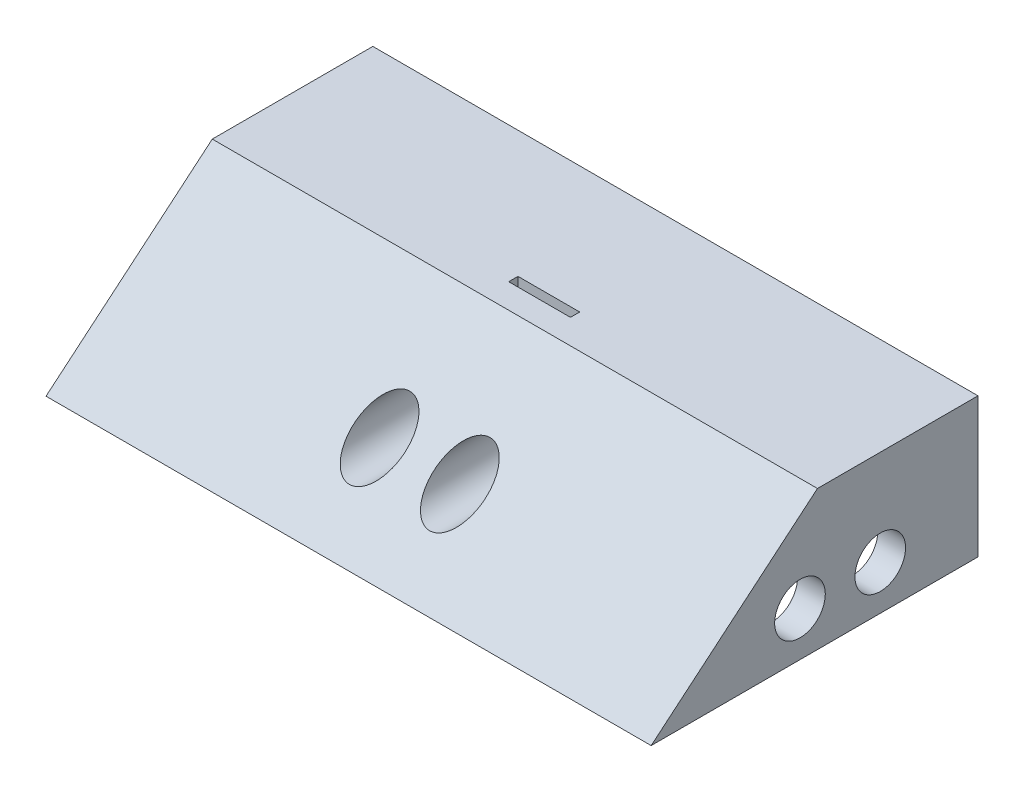
ISO-10303-21;
HEADER;
FILE_DESCRIPTION(('STEP AP214'),'2;1');
FILE_NAME('part.step','',(''),(''),'','','');
FILE_SCHEMA(('AUTOMOTIVE_DESIGN { 1 0 10303 214 1 1 1 1 }'));
ENDSEC;
DATA;
#1=APPLICATION_CONTEXT('core data for automotive mechanical design processes');
#2=APPLICATION_PROTOCOL_DEFINITION('international standard','automotive_design',2000,#1);
#3=PRODUCT_CONTEXT('',#1,'mechanical');
#4=PRODUCT('Part','Part','',(#3));
#5=PRODUCT_RELATED_PRODUCT_CATEGORY('part','',(#4));
#6=PRODUCT_DEFINITION_FORMATION('','',#4);
#7=PRODUCT_DEFINITION_CONTEXT('part definition',#1,'design');
#8=PRODUCT_DEFINITION('design','',#6,#7);
#9=PRODUCT_DEFINITION_SHAPE('','',#8);
#10=(LENGTH_UNIT() NAMED_UNIT(*) SI_UNIT(.MILLI.,.METRE.));
#11=(NAMED_UNIT(*) PLANE_ANGLE_UNIT() SI_UNIT($,.RADIAN.));
#12=(NAMED_UNIT(*) SI_UNIT($,.STERADIAN.) SOLID_ANGLE_UNIT());
#13=UNCERTAINTY_MEASURE_WITH_UNIT(LENGTH_MEASURE(1.E-05),#10,'distance_accuracy_value','');
#14=(GEOMETRIC_REPRESENTATION_CONTEXT(3) GLOBAL_UNCERTAINTY_ASSIGNED_CONTEXT((#13)) GLOBAL_UNIT_ASSIGNED_CONTEXT((#10,
#11,#12)) REPRESENTATION_CONTEXT('',''));
#15=CARTESIAN_POINT('',(0.,0.,0.));
#16=DIRECTION('',(0.,0.,1.));
#17=DIRECTION('',(1.,0.,0.));
#18=AXIS2_PLACEMENT_3D('',#15,#16,#17);
#19=CARTESIAN_POINT('',(111.,19.33,-105.851));
#20=DIRECTION('',(0.,0.,1.));
#21=DIRECTION('',(1.,0.,0.));
#22=AXIS2_PLACEMENT_3D('',#19,#20,#21);
#23=CYLINDRICAL_SURFACE('',#22,8.2);
#24=CARTESIAN_POINT('',(111.,19.33,-43.));
#25=DIRECTION('',(0.,0.,1.));
#26=DIRECTION('',(1.,0.,0.));
#27=AXIS2_PLACEMENT_3D('',#24,#25,#26);
#28=CIRCLE('',#27,8.2);
#29=CARTESIAN_POINT('',(119.2,19.33,-43.));
#30=VERTEX_POINT('',#29);
#31=EDGE_CURVE('E177',#30,#30,#28,.T.);
#32=ORIENTED_EDGE('',*,*,#31,.F.);
#33=EDGE_LOOP('',(#32));
#34=FACE_BOUND('',#33,.T.);
#35=CARTESIAN_POINT('',(111.,19.33,-23.036596944846));
#36=DIRECTION('',(0.,0.766044443118977,0.64278760968654));
#37=DIRECTION('',(0.,-0.64278760968654,0.766044443118977));
#38=AXIS2_PLACEMENT_3D('',#35,#36,#37);
#39=ELLIPSE('',#38,12.7569353802554,8.2);
#40=CARTESIAN_POINT('',(111.,11.13,-13.2642174855735));
#41=VERTEX_POINT('',#40);
#42=EDGE_CURVE('E137',#41,#41,#39,.T.);
#43=ORIENTED_EDGE('',*,*,#42,.T.);
#44=EDGE_LOOP('',(#43));
#45=FACE_BOUND('',#44,.T.);
#46=ADVANCED_FACE('F42',(#34,#45),#23,.F.);
#47=CARTESIAN_POINT('',(85.,19.33,-105.851));
#48=DIRECTION('',(0.,0.,1.));
#49=DIRECTION('',(1.,0.,0.));
#50=AXIS2_PLACEMENT_3D('',#47,#48,#49);
#51=CYLINDRICAL_SURFACE('',#50,8.2);
#52=CARTESIAN_POINT('',(85.,19.33,-43.));
#53=DIRECTION('',(0.,0.,1.));
#54=DIRECTION('',(1.,0.,0.));
#55=AXIS2_PLACEMENT_3D('',#52,#53,#54);
#56=CIRCLE('',#55,8.2);
#57=CARTESIAN_POINT('',(93.2,19.33,-43.));
#58=VERTEX_POINT('',#57);
#59=EDGE_CURVE('E174',#58,#58,#56,.T.);
#60=ORIENTED_EDGE('',*,*,#59,.F.);
#61=EDGE_LOOP('',(#60));
#62=FACE_BOUND('',#61,.T.);
#63=CARTESIAN_POINT('',(85.,19.33,-23.036596944846));
#64=DIRECTION('',(0.,0.766044443118977,0.64278760968654));
#65=DIRECTION('',(0.,-0.64278760968654,0.766044443118977));
#66=AXIS2_PLACEMENT_3D('',#63,#64,#65);
#67=ELLIPSE('',#66,12.7569353802554,8.2);
#68=CARTESIAN_POINT('',(85.,11.13,-13.2642174855735));
#69=VERTEX_POINT('',#68);
#70=EDGE_CURVE('E166',#69,#69,#67,.T.);
#71=ORIENTED_EDGE('',*,*,#70,.T.);
#72=EDGE_LOOP('',(#71));
#73=FACE_BOUND('',#72,.T.);
#74=ADVANCED_FACE('F345',(#62,#73),#51,.F.);
#75=CARTESIAN_POINT('',(4.,0.,0.));
#76=DIRECTION('',(1.,0.,0.));
#77=DIRECTION('',(0.,0.,-1.));
#78=AXIS2_PLACEMENT_3D('',#75,#76,#77);
#79=PLANE('',#78);
#80=CARTESIAN_POINT('',(4.,14.33,-74.1923055190832));
#81=DIRECTION('',(1.,0.,0.));
#82=DIRECTION('',(0.,0.,-1.));
#83=AXIS2_PLACEMENT_3D('',#80,#81,#82);
#84=CIRCLE('',#83,12.2);
#85=CARTESIAN_POINT('',(4.,14.33,-86.3923055190832));
#86=VERTEX_POINT('',#85);
#87=EDGE_CURVE('E293',#86,#86,#84,.F.);
#88=ORIENTED_EDGE('',*,*,#87,.T.);
#89=EDGE_LOOP('',(#88));
#90=FACE_BOUND('',#89,.T.);
#91=CARTESIAN_POINT('',(4.,14.33,-48.1923055190832));
#92=DIRECTION('',(1.,0.,0.));
#93=DIRECTION('',(0.,0.,-1.));
#94=AXIS2_PLACEMENT_3D('',#91,#92,#93);
#95=CIRCLE('',#94,12.2);
#96=CARTESIAN_POINT('',(4.,14.33,-60.3923055190832));
#97=VERTEX_POINT('',#96);
#98=EDGE_CURVE('E290',#97,#97,#95,.F.);
#99=ORIENTED_EDGE('',*,*,#98,.T.);
#100=EDGE_LOOP('',(#99));
#101=FACE_BOUND('',#100,.T.);
#102=DIRECTION('',(0.,-0.64278760968654,0.766044443118977));
#103=VECTOR('',#102,1.);
#104=CARTESIAN_POINT('',(3.99999999999998,-3.06417777247591,-2.57115043874616));
#105=LINE('',#104,#103);
#106=CARTESIAN_POINT('',(4.,41.19,-55.311225786397));
#107=VERTEX_POINT('',#106);
#108=CARTESIAN_POINT('',(4.,0.,-6.22289530744164));
#109=VERTEX_POINT('',#108);
#110=EDGE_CURVE('E217',#107,#109,#105,.T.);
#111=ORIENTED_EDGE('',*,*,#110,.T.);
#112=DIRECTION('',(0.,0.,-1.));
#113=VECTOR('',#112,1.);
#114=CARTESIAN_POINT('',(4.,0.,0.));
#115=LINE('',#114,#113);
#116=CARTESIAN_POINT('',(4.,0.,-101.85));
#117=VERTEX_POINT('',#116);
#118=EDGE_CURVE('E222',#109,#117,#115,.T.);
#119=ORIENTED_EDGE('',*,*,#118,.T.);
#120=DIRECTION('',(0.,1.,0.));
#121=VECTOR('',#120,1.);
#122=CARTESIAN_POINT('',(4.,0.,-101.85));
#123=LINE('',#122,#121);
#124=CARTESIAN_POINT('',(4.,41.19,-101.85));
#125=VERTEX_POINT('',#124);
#126=EDGE_CURVE('E233',#117,#125,#123,.T.);
#127=ORIENTED_EDGE('',*,*,#126,.T.);
#128=DIRECTION('',(0.,0.,1.));
#129=VECTOR('',#128,1.);
#130=CARTESIAN_POINT('',(4.,41.19,-105.85));
#131=LINE('',#130,#129);
#132=EDGE_CURVE('E226',#125,#107,#131,.T.);
#133=ORIENTED_EDGE('',*,*,#132,.T.);
#134=EDGE_LOOP('',(#111,#119,#127,#133));
#135=FACE_BOUND('',#134,.T.);
#136=ADVANCED_FACE('F320',(#90,#101,#135),#79,.T.);
#137=CARTESIAN_POINT('',(196.,0.,0.));
#138=DIRECTION('',(0.,1.,0.));
#139=DIRECTION('',(0.,0.,1.));
#140=AXIS2_PLACEMENT_3D('',#137,#138,#139);
#141=PLANE('',#140);
#142=DIRECTION('',(0.,0.,-1.));
#143=VECTOR('',#142,1.);
#144=CARTESIAN_POINT('',(0.,0.,0.));
#145=LINE('',#144,#143);
#146=CARTESIAN_POINT('',(0.,0.,0.));
#147=VERTEX_POINT('',#146);
#148=CARTESIAN_POINT('',(0.,0.,-105.85));
#149=VERTEX_POINT('',#148);
#150=EDGE_CURVE('E262',#147,#149,#145,.T.);
#151=ORIENTED_EDGE('',*,*,#150,.T.);
#152=DIRECTION('',(-1.,0.,0.));
#153=VECTOR('',#152,1.);
#154=CARTESIAN_POINT('',(196.,0.,-105.85));
#155=LINE('',#154,#153);
#156=CARTESIAN_POINT('',(196.,0.,-105.85));
#157=VERTEX_POINT('',#156);
#158=EDGE_CURVE('E272',#157,#149,#155,.T.);
#159=ORIENTED_EDGE('',*,*,#158,.F.);
#160=DIRECTION('',(0.,0.,-1.));
#161=VECTOR('',#160,1.);
#162=CARTESIAN_POINT('',(196.,0.,0.));
#163=LINE('',#162,#161);
#164=CARTESIAN_POINT('',(196.,0.,0.));
#165=VERTEX_POINT('',#164);
#166=EDGE_CURVE('E252',#165,#157,#163,.T.);
#167=ORIENTED_EDGE('',*,*,#166,.F.);
#168=DIRECTION('',(-1.,0.,0.));
#169=VECTOR('',#168,1.);
#170=CARTESIAN_POINT('',(196.,0.,0.));
#171=LINE('',#170,#169);
#172=EDGE_CURVE('E275',#165,#147,#171,.T.);
#173=ORIENTED_EDGE('',*,*,#172,.T.);
#174=EDGE_LOOP('',(#151,#159,#167,#173));
#175=FACE_BOUND('',#174,.T.);
#176=ORIENTED_EDGE('',*,*,#118,.F.);
#177=DIRECTION('',(-1.,0.,0.));
#178=VECTOR('',#177,1.);
#179=CARTESIAN_POINT('',(196.,0.,-6.22289530744164));
#180=LINE('',#179,#178);
#181=CARTESIAN_POINT('',(192.,0.,-6.22289530744164));
#182=VERTEX_POINT('',#181);
#183=EDGE_CURVE('E241',#182,#109,#180,.T.);
#184=ORIENTED_EDGE('',*,*,#183,.F.);
#185=DIRECTION('',(0.,0.,-1.));
#186=VECTOR('',#185,1.);
#187=CARTESIAN_POINT('',(192.,0.,0.));
#188=LINE('',#187,#186);
#189=CARTESIAN_POINT('',(192.,0.,-101.85));
#190=VERTEX_POINT('',#189);
#191=EDGE_CURVE('E225',#182,#190,#188,.T.);
#192=ORIENTED_EDGE('',*,*,#191,.T.);
#193=DIRECTION('',(-1.,0.,0.));
#194=VECTOR('',#193,1.);
#195=CARTESIAN_POINT('',(196.,0.,-101.85));
#196=LINE('',#195,#194);
#197=EDGE_CURVE('E238',#190,#117,#196,.T.);
#198=ORIENTED_EDGE('',*,*,#197,.T.);
#199=EDGE_LOOP('',(#176,#184,#192,#198));
#200=FACE_BOUND('',#199,.T.);
#201=ADVANCED_FACE('F324',(#175,#200),#141,.F.);
#202=CARTESIAN_POINT('',(196.,0.,0.));
#203=DIRECTION('',(0.,-0.766044443118977,-0.64278760968654));
#204=DIRECTION('',(0.,0.64278760968654,-0.766044443118977));
#205=AXIS2_PLACEMENT_3D('',#202,#203,#204);
#206=PLANE('',#205);
#207=DIRECTION('',(0.,-0.64278760968654,0.766044443118977));
#208=VECTOR('',#207,1.);
#209=CARTESIAN_POINT('',(0.,0.,0.));
#210=LINE('',#209,#208);
#211=CARTESIAN_POINT('',(0.,45.19,-53.8553448493322));
#212=VERTEX_POINT('',#211);
#213=EDGE_CURVE('E243',#212,#147,#210,.T.);
#214=ORIENTED_EDGE('',*,*,#213,.T.);
#215=ORIENTED_EDGE('',*,*,#172,.F.);
#216=DIRECTION('',(0.,-0.64278760968654,0.766044443118977));
#217=VECTOR('',#216,1.);
#218=CARTESIAN_POINT('',(196.,0.,0.));
#219=LINE('',#218,#217);
#220=CARTESIAN_POINT('',(196.,45.19,-53.8553448493322));
#221=VERTEX_POINT('',#220);
#222=EDGE_CURVE('E249',#221,#165,#219,.T.);
#223=ORIENTED_EDGE('',*,*,#222,.F.);
#224=DIRECTION('',(-1.,0.,0.));
#225=VECTOR('',#224,1.);
#226=CARTESIAN_POINT('',(196.,45.19,-53.8553448493322));
#227=LINE('',#226,#225);
#228=EDGE_CURVE('E259',#221,#212,#227,.T.);
#229=ORIENTED_EDGE('',*,*,#228,.T.);
#230=EDGE_LOOP('',(#214,#215,#223,#229));
#231=FACE_BOUND('',#230,.T.);
#232=ORIENTED_EDGE('',*,*,#70,.F.);
#233=EDGE_LOOP('',(#232));
#234=FACE_BOUND('',#233,.T.);
#235=ORIENTED_EDGE('',*,*,#42,.F.);
#236=EDGE_LOOP('',(#235));
#237=FACE_BOUND('',#236,.T.);
#238=ADVANCED_FACE('F437',(#231,#234,#237),#206,.F.);
#239=CARTESIAN_POINT('',(196.,0.,-105.85));
#240=DIRECTION('',(0.,0.,1.));
#241=DIRECTION('',(1.,0.,0.));
#242=AXIS2_PLACEMENT_3D('',#239,#240,#241);
#243=PLANE('',#242);
#244=DIRECTION('',(0.,1.,0.));
#245=VECTOR('',#244,1.);
#246=CARTESIAN_POINT('',(0.,0.,-105.85));
#247=LINE('',#246,#245);
#248=CARTESIAN_POINT('',(0.,45.19,-105.85));
#249=VERTEX_POINT('',#248);
#250=EDGE_CURVE('E264',#149,#249,#247,.T.);
#251=ORIENTED_EDGE('',*,*,#250,.T.);
#252=DIRECTION('',(-1.,0.,0.));
#253=VECTOR('',#252,1.);
#254=CARTESIAN_POINT('',(196.,45.19,-105.85));
#255=LINE('',#254,#253);
#256=CARTESIAN_POINT('',(196.,45.19,-105.85));
#257=VERTEX_POINT('',#256);
#258=EDGE_CURVE('E269',#257,#249,#255,.T.);
#259=ORIENTED_EDGE('',*,*,#258,.F.);
#260=DIRECTION('',(0.,1.,0.));
#261=VECTOR('',#260,1.);
#262=CARTESIAN_POINT('',(196.,0.,-105.85));
#263=LINE('',#262,#261);
#264=EDGE_CURVE('E255',#157,#257,#263,.T.);
#265=ORIENTED_EDGE('',*,*,#264,.F.);
#266=ORIENTED_EDGE('',*,*,#158,.T.);
#267=EDGE_LOOP('',(#251,#259,#265,#266));
#268=FACE_BOUND('',#267,.T.);
#269=ADVANCED_FACE('F429',(#268),#243,.F.);
#270=CARTESIAN_POINT('',(196.,45.19,-105.85));
#271=DIRECTION('',(0.,-1.,0.));
#272=DIRECTION('',(0.,0.,-1.));
#273=AXIS2_PLACEMENT_3D('',#270,#271,#272);
#274=PLANE('',#273);
#275=DIRECTION('',(1.,0.,0.));
#276=VECTOR('',#275,1.);
#277=CARTESIAN_POINT('',(88.,45.19,-61.8553448493322));
#278=LINE('',#277,#276);
#279=CARTESIAN_POINT('',(88.,45.19,-61.8553448493322));
#280=VERTEX_POINT('',#279);
#281=CARTESIAN_POINT('',(108.,45.19,-61.8553448493322));
#282=VERTEX_POINT('',#281);
#283=EDGE_CURVE('E150',#280,#282,#278,.T.);
#284=ORIENTED_EDGE('',*,*,#283,.F.);
#285=DIRECTION('',(0.,0.,1.));
#286=VECTOR('',#285,1.);
#287=CARTESIAN_POINT('',(88.,45.19,-61.8553448493322));
#288=LINE('',#287,#286);
#289=CARTESIAN_POINT('',(88.,45.19,-64.8553448493322));
#290=VERTEX_POINT('',#289);
#291=EDGE_CURVE('E57',#290,#280,#288,.T.);
#292=ORIENTED_EDGE('',*,*,#291,.F.);
#293=DIRECTION('',(-1.,0.,0.));
#294=VECTOR('',#293,1.);
#295=CARTESIAN_POINT('',(88.,45.19,-64.8553448493322));
#296=LINE('',#295,#294);
#297=CARTESIAN_POINT('',(108.,45.19,-64.8553448493322));
#298=VERTEX_POINT('',#297);
#299=EDGE_CURVE('E143',#298,#290,#296,.T.);
#300=ORIENTED_EDGE('',*,*,#299,.F.);
#301=DIRECTION('',(0.,0.,-1.));
#302=VECTOR('',#301,1.);
#303=CARTESIAN_POINT('',(108.,45.19,-61.8553448493322));
#304=LINE('',#303,#302);
#305=EDGE_CURVE('E157',#282,#298,#304,.T.);
#306=ORIENTED_EDGE('',*,*,#305,.F.);
#307=EDGE_LOOP('',(#284,#292,#300,#306));
#308=FACE_BOUND('',#307,.T.);
#309=DIRECTION('',(0.,0.,1.));
#310=VECTOR('',#309,1.);
#311=CARTESIAN_POINT('',(0.,45.19,-105.85));
#312=LINE('',#311,#310);
#313=EDGE_CURVE('E253',#249,#212,#312,.T.);
#314=ORIENTED_EDGE('',*,*,#313,.T.);
#315=ORIENTED_EDGE('',*,*,#228,.F.);
#316=DIRECTION('',(0.,0.,1.));
#317=VECTOR('',#316,1.);
#318=CARTESIAN_POINT('',(196.,45.19,-105.85));
#319=LINE('',#318,#317);
#320=EDGE_CURVE('E257',#257,#221,#319,.T.);
#321=ORIENTED_EDGE('',*,*,#320,.F.);
#322=ORIENTED_EDGE('',*,*,#258,.T.);
#323=EDGE_LOOP('',(#314,#315,#321,#322));
#324=FACE_BOUND('',#323,.T.);
#325=ADVANCED_FACE('F419',(#308,#324),#274,.F.);
#326=CARTESIAN_POINT('',(196.,0.,0.));
#327=DIRECTION('',(1.,0.,0.));
#328=DIRECTION('',(0.,0.,-1.));
#329=AXIS2_PLACEMENT_3D('',#326,#327,#328);
#330=PLANE('',#329);
#331=ORIENTED_EDGE('',*,*,#222,.T.);
#332=ORIENTED_EDGE('',*,*,#166,.T.);
#333=ORIENTED_EDGE('',*,*,#264,.T.);
#334=ORIENTED_EDGE('',*,*,#320,.T.);
#335=EDGE_LOOP('',(#331,#332,#333,#334));
#336=FACE_BOUND('',#335,.T.);
#337=CARTESIAN_POINT('',(196.,14.33,-48.1923055190832));
#338=DIRECTION('',(1.,0.,0.));
#339=DIRECTION('',(0.,0.,-1.));
#340=AXIS2_PLACEMENT_3D('',#337,#338,#339);
#341=CIRCLE('',#340,8.2);
#342=CARTESIAN_POINT('',(196.,14.33,-56.3923055190832));
#343=VERTEX_POINT('',#342);
#344=EDGE_CURVE('E214',#343,#343,#341,.T.);
#345=ORIENTED_EDGE('',*,*,#344,.F.);
#346=EDGE_LOOP('',(#345));
#347=FACE_BOUND('',#346,.T.);
#348=CARTESIAN_POINT('',(196.,14.33,-74.1923055190832));
#349=DIRECTION('',(1.,0.,0.));
#350=DIRECTION('',(0.,0.,-1.));
#351=AXIS2_PLACEMENT_3D('',#348,#349,#350);
#352=CIRCLE('',#351,8.2);
#353=CARTESIAN_POINT('',(196.,14.33,-82.3923055190832));
#354=VERTEX_POINT('',#353);
#355=EDGE_CURVE('E213',#354,#354,#352,.T.);
#356=ORIENTED_EDGE('',*,*,#355,.F.);
#357=EDGE_LOOP('',(#356));
#358=FACE_BOUND('',#357,.T.);
#359=ADVANCED_FACE('F417',(#336,#347,#358),#330,.T.);
#360=CARTESIAN_POINT('',(0.,0.,0.));
#361=DIRECTION('',(1.,0.,0.));
#362=DIRECTION('',(0.,0.,-1.));
#363=AXIS2_PLACEMENT_3D('',#360,#361,#362);
#364=PLANE('',#363);
#365=CARTESIAN_POINT('',(0.,14.33,-74.1923055190832));
#366=DIRECTION('',(1.,0.,0.));
#367=DIRECTION('',(0.,0.,-1.));
#368=AXIS2_PLACEMENT_3D('',#365,#366,#367);
#369=CIRCLE('',#368,8.2);
#370=CARTESIAN_POINT('',(0.,14.33,-82.3923055190832));
#371=VERTEX_POINT('',#370);
#372=EDGE_CURVE('E195',#371,#371,#369,.T.);
#373=ORIENTED_EDGE('',*,*,#372,.T.);
#374=EDGE_LOOP('',(#373));
#375=FACE_BOUND('',#374,.T.);
#376=ORIENTED_EDGE('',*,*,#213,.F.);
#377=ORIENTED_EDGE('',*,*,#313,.F.);
#378=ORIENTED_EDGE('',*,*,#250,.F.);
#379=ORIENTED_EDGE('',*,*,#150,.F.);
#380=EDGE_LOOP('',(#376,#377,#378,#379));
#381=FACE_BOUND('',#380,.T.);
#382=CARTESIAN_POINT('',(0.,14.33,-48.1923055190832));
#383=DIRECTION('',(1.,0.,0.));
#384=DIRECTION('',(0.,0.,-1.));
#385=AXIS2_PLACEMENT_3D('',#382,#383,#384);
#386=CIRCLE('',#385,8.2);
#387=CARTESIAN_POINT('',(0.,14.33,-56.3923055190832));
#388=VERTEX_POINT('',#387);
#389=EDGE_CURVE('E196',#388,#388,#386,.T.);
#390=ORIENTED_EDGE('',*,*,#389,.T.);
#391=EDGE_LOOP('',(#390));
#392=FACE_BOUND('',#391,.T.);
#393=ADVANCED_FACE('F311',(#375,#381,#392),#364,.F.);
#394=CARTESIAN_POINT('',(196.,-3.06417777247591,-2.57115043874616));
#395=DIRECTION('',(0.,-0.766044443118977,-0.64278760968654));
#396=DIRECTION('',(0.,0.64278760968654,-0.766044443118977));
#397=AXIS2_PLACEMENT_3D('',#394,#395,#396);
#398=PLANE('',#397);
#399=CARTESIAN_POINT('',(85.,19.33,-29.2594922522877));
#400=DIRECTION('',(0.,-0.766044443118977,-0.64278760968654));
#401=DIRECTION('',(0.,-0.64278760968654,0.766044443118977));
#402=AXIS2_PLACEMENT_3D('',#399,#400,#401);
#403=ELLIPSE('',#402,14.3126592071158,9.2);
#404=CARTESIAN_POINT('',(85.,10.13,-18.295359200421));
#405=VERTEX_POINT('',#404);
#406=EDGE_CURVE('E11',#405,#405,#403,.T.);
#407=ORIENTED_EDGE('',*,*,#406,.F.);
#408=EDGE_LOOP('',(#407));
#409=FACE_BOUND('',#408,.T.);
#410=CARTESIAN_POINT('',(111.,19.33,-29.2594922522877));
#411=DIRECTION('',(0.,-0.766044443118977,-0.64278760968654));
#412=DIRECTION('',(0.,-0.64278760968654,0.766044443118977));
#413=AXIS2_PLACEMENT_3D('',#410,#411,#412);
#414=ELLIPSE('',#413,14.3126592071158,9.2);
#415=CARTESIAN_POINT('',(111.,10.13,-18.295359200421));
#416=VERTEX_POINT('',#415);
#417=EDGE_CURVE('E50',#416,#416,#414,.T.);
#418=ORIENTED_EDGE('',*,*,#417,.F.);
#419=EDGE_LOOP('',(#418));
#420=FACE_BOUND('',#419,.T.);
#421=ORIENTED_EDGE('',*,*,#110,.F.);
#422=DIRECTION('',(-1.,0.,0.));
#423=VECTOR('',#422,1.);
#424=CARTESIAN_POINT('',(196.,41.19,-55.311225786397));
#425=LINE('',#424,#423);
#426=CARTESIAN_POINT('',(192.,41.19,-55.311225786397));
#427=VERTEX_POINT('',#426);
#428=EDGE_CURVE('E227',#427,#107,#425,.T.);
#429=ORIENTED_EDGE('',*,*,#428,.F.);
#430=DIRECTION('',(0.,-0.64278760968654,0.766044443118977));
#431=VECTOR('',#430,1.);
#432=CARTESIAN_POINT('',(192.,-3.06417777247591,-2.57115043874616));
#433=LINE('',#432,#431);
#434=EDGE_CURVE('E223',#427,#182,#433,.T.);
#435=ORIENTED_EDGE('',*,*,#434,.T.);
#436=ORIENTED_EDGE('',*,*,#183,.T.);
#437=EDGE_LOOP('',(#421,#429,#435,#436));
#438=FACE_BOUND('',#437,.T.);
#439=ADVANCED_FACE('F307',(#409,#420,#438),#398,.T.);
#440=CARTESIAN_POINT('',(196.,0.,-101.85));
#441=DIRECTION('',(0.,0.,1.));
#442=DIRECTION('',(1.,0.,0.));
#443=AXIS2_PLACEMENT_3D('',#440,#441,#442);
#444=PLANE('',#443);
#445=ORIENTED_EDGE('',*,*,#126,.F.);
#446=ORIENTED_EDGE('',*,*,#197,.F.);
#447=DIRECTION('',(0.,1.,0.));
#448=VECTOR('',#447,1.);
#449=CARTESIAN_POINT('',(192.,0.,-101.85));
#450=LINE('',#449,#448);
#451=CARTESIAN_POINT('',(192.,41.19,-101.85));
#452=VERTEX_POINT('',#451);
#453=EDGE_CURVE('E235',#190,#452,#450,.T.);
#454=ORIENTED_EDGE('',*,*,#453,.T.);
#455=DIRECTION('',(-1.,0.,0.));
#456=VECTOR('',#455,1.);
#457=CARTESIAN_POINT('',(196.,41.19,-101.85));
#458=LINE('',#457,#456);
#459=EDGE_CURVE('E230',#452,#125,#458,.T.);
#460=ORIENTED_EDGE('',*,*,#459,.T.);
#461=EDGE_LOOP('',(#445,#446,#454,#460));
#462=FACE_BOUND('',#461,.T.);
#463=ADVANCED_FACE('F310',(#462),#444,.T.);
#464=CARTESIAN_POINT('',(196.,41.19,-105.85));
#465=DIRECTION('',(0.,-1.,0.));
#466=DIRECTION('',(0.,0.,-1.));
#467=AXIS2_PLACEMENT_3D('',#464,#465,#466);
#468=PLANE('',#467);
#469=DIRECTION('',(0.,0.,1.));
#470=VECTOR('',#469,1.);
#471=CARTESIAN_POINT('',(88.,41.19,-61.8553448493322));
#472=LINE('',#471,#470);
#473=CARTESIAN_POINT('',(88.,41.19,-64.8553448493322));
#474=VERTEX_POINT('',#473);
#475=CARTESIAN_POINT('',(88.,41.19,-61.8553448493322));
#476=VERTEX_POINT('',#475);
#477=EDGE_CURVE('E141',#474,#476,#472,.T.);
#478=ORIENTED_EDGE('',*,*,#477,.T.);
#479=DIRECTION('',(1.,0.,0.));
#480=VECTOR('',#479,1.);
#481=CARTESIAN_POINT('',(88.,41.19,-61.8553448493322));
#482=LINE('',#481,#480);
#483=CARTESIAN_POINT('',(108.,41.19,-61.8553448493322));
#484=VERTEX_POINT('',#483);
#485=EDGE_CURVE('E130',#476,#484,#482,.T.);
#486=ORIENTED_EDGE('',*,*,#485,.T.);
#487=DIRECTION('',(0.,0.,-1.));
#488=VECTOR('',#487,1.);
#489=CARTESIAN_POINT('',(108.,41.19,-61.8553448493322));
#490=LINE('',#489,#488);
#491=CARTESIAN_POINT('',(108.,41.19,-64.8553448493322));
#492=VERTEX_POINT('',#491);
#493=EDGE_CURVE('E152',#484,#492,#490,.T.);
#494=ORIENTED_EDGE('',*,*,#493,.T.);
#495=DIRECTION('',(-1.,0.,0.));
#496=VECTOR('',#495,1.);
#497=CARTESIAN_POINT('',(88.,41.19,-64.8553448493322));
#498=LINE('',#497,#496);
#499=EDGE_CURVE('E148',#492,#474,#498,.T.);
#500=ORIENTED_EDGE('',*,*,#499,.T.);
#501=EDGE_LOOP('',(#478,#486,#494,#500));
#502=FACE_BOUND('',#501,.T.);
#503=ORIENTED_EDGE('',*,*,#132,.F.);
#504=ORIENTED_EDGE('',*,*,#459,.F.);
#505=DIRECTION('',(0.,0.,1.));
#506=VECTOR('',#505,1.);
#507=CARTESIAN_POINT('',(192.,41.19,-105.85));
#508=LINE('',#507,#506);
#509=EDGE_CURVE('E231',#452,#427,#508,.T.);
#510=ORIENTED_EDGE('',*,*,#509,.T.);
#511=ORIENTED_EDGE('',*,*,#428,.T.);
#512=EDGE_LOOP('',(#503,#504,#510,#511));
#513=FACE_BOUND('',#512,.T.);
#514=ADVANCED_FACE('F146',(#502,#513),#468,.T.);
#515=CARTESIAN_POINT('',(192.,0.,0.));
#516=DIRECTION('',(1.,0.,0.));
#517=DIRECTION('',(0.,0.,-1.));
#518=AXIS2_PLACEMENT_3D('',#515,#516,#517);
#519=PLANE('',#518);
#520=CARTESIAN_POINT('',(192.,14.33,-74.1923055190832));
#521=DIRECTION('',(1.,0.,0.));
#522=DIRECTION('',(0.,0.,-1.));
#523=AXIS2_PLACEMENT_3D('',#520,#521,#522);
#524=CIRCLE('',#523,12.2);
#525=CARTESIAN_POINT('',(192.,14.33,-86.3923055190832));
#526=VERTEX_POINT('',#525);
#527=EDGE_CURVE('E281',#526,#526,#524,.T.);
#528=ORIENTED_EDGE('',*,*,#527,.T.);
#529=EDGE_LOOP('',(#528));
#530=FACE_BOUND('',#529,.T.);
#531=CARTESIAN_POINT('',(192.,14.33,-48.1923055190832));
#532=DIRECTION('',(1.,0.,0.));
#533=DIRECTION('',(0.,0.,-1.));
#534=AXIS2_PLACEMENT_3D('',#531,#532,#533);
#535=CIRCLE('',#534,12.2);
#536=CARTESIAN_POINT('',(192.,14.33,-60.3923055190832));
#537=VERTEX_POINT('',#536);
#538=EDGE_CURVE('E278',#537,#537,#535,.T.);
#539=ORIENTED_EDGE('',*,*,#538,.T.);
#540=EDGE_LOOP('',(#539));
#541=FACE_BOUND('',#540,.T.);
#542=ORIENTED_EDGE('',*,*,#434,.F.);
#543=ORIENTED_EDGE('',*,*,#509,.F.);
#544=ORIENTED_EDGE('',*,*,#453,.F.);
#545=ORIENTED_EDGE('',*,*,#191,.F.);
#546=EDGE_LOOP('',(#542,#543,#544,#545));
#547=FACE_BOUND('',#546,.T.);
#548=ADVANCED_FACE('F331',(#530,#541,#547),#519,.F.);
#549=CARTESIAN_POINT('',(192.,14.33,-74.1923055190832));
#550=DIRECTION('',(1.,0.,0.));
#551=DIRECTION('',(0.,0.,-1.));
#552=AXIS2_PLACEMENT_3D('',#549,#550,#551);
#553=CYLINDRICAL_SURFACE('',#552,8.2);
#554=ORIENTED_EDGE('',*,*,#355,.T.);
#555=EDGE_LOOP('',(#554));
#556=FACE_BOUND('',#555,.T.);
#557=CARTESIAN_POINT('',(187.,14.33,-74.1923055190832));
#558=DIRECTION('',(1.,0.,0.));
#559=DIRECTION('',(0.,0.,-1.));
#560=AXIS2_PLACEMENT_3D('',#557,#558,#559);
#561=CIRCLE('',#560,8.2);
#562=CARTESIAN_POINT('',(187.,14.33,-82.3923055190832));
#563=VERTEX_POINT('',#562);
#564=EDGE_CURVE('E204',#563,#563,#561,.T.);
#565=ORIENTED_EDGE('',*,*,#564,.F.);
#566=EDGE_LOOP('',(#565));
#567=FACE_BOUND('',#566,.T.);
#568=ADVANCED_FACE('F339',(#556,#567),#553,.F.);
#569=CARTESIAN_POINT('',(192.,14.33,-48.1923055190832));
#570=DIRECTION('',(1.,0.,0.));
#571=DIRECTION('',(0.,0.,-1.));
#572=AXIS2_PLACEMENT_3D('',#569,#570,#571);
#573=CYLINDRICAL_SURFACE('',#572,8.2);
#574=ORIENTED_EDGE('',*,*,#344,.T.);
#575=EDGE_LOOP('',(#574));
#576=FACE_BOUND('',#575,.T.);
#577=CARTESIAN_POINT('',(187.,14.33,-48.1923055190832));
#578=DIRECTION('',(1.,0.,0.));
#579=DIRECTION('',(0.,0.,-1.));
#580=AXIS2_PLACEMENT_3D('',#577,#578,#579);
#581=CIRCLE('',#580,8.2);
#582=CARTESIAN_POINT('',(187.,14.33,-56.3923055190832));
#583=VERTEX_POINT('',#582);
#584=EDGE_CURVE('E207',#583,#583,#581,.T.);
#585=ORIENTED_EDGE('',*,*,#584,.F.);
#586=EDGE_LOOP('',(#585));
#587=FACE_BOUND('',#586,.T.);
#588=ADVANCED_FACE('F400',(#576,#587),#573,.F.);
#589=CARTESIAN_POINT('',(187.,14.33,-48.1923055190832));
#590=DIRECTION('',(1.,0.,0.));
#591=DIRECTION('',(0.,0.,-1.));
#592=AXIS2_PLACEMENT_3D('',#589,#590,#591);
#593=CYLINDRICAL_SURFACE('',#592,9.2);
#594=CARTESIAN_POINT('',(189.,14.33,-48.1923055190832));
#595=DIRECTION('',(1.,0.,0.));
#596=DIRECTION('',(0.,0.,-1.));
#597=AXIS2_PLACEMENT_3D('',#594,#595,#596);
#598=CIRCLE('',#597,9.2);
#599=CARTESIAN_POINT('',(189.,14.33,-57.3923055190832));
#600=VERTEX_POINT('',#599);
#601=EDGE_CURVE('E287',#600,#600,#598,.F.);
#602=ORIENTED_EDGE('',*,*,#601,.T.);
#603=EDGE_LOOP('',(#602));
#604=FACE_BOUND('',#603,.T.);
#605=CARTESIAN_POINT('',(187.,14.33,-48.1923055190832));
#606=DIRECTION('',(1.,0.,0.));
#607=DIRECTION('',(0.,0.,-1.));
#608=AXIS2_PLACEMENT_3D('',#605,#606,#607);
#609=CIRCLE('',#608,9.2);
#610=CARTESIAN_POINT('',(187.,14.33,-57.3923055190832));
#611=VERTEX_POINT('',#610);
#612=EDGE_CURVE('E210',#611,#611,#609,.T.);
#613=ORIENTED_EDGE('',*,*,#612,.T.);
#614=EDGE_LOOP('',(#613));
#615=FACE_BOUND('',#614,.T.);
#616=ADVANCED_FACE('F396',(#604,#615),#593,.T.);
#617=CARTESIAN_POINT('',(187.,14.33,-48.1923055190832));
#618=DIRECTION('',(1.,0.,0.));
#619=DIRECTION('',(0.,0.,-1.));
#620=AXIS2_PLACEMENT_3D('',#617,#618,#619);
#621=PLANE('',#620);
#622=ORIENTED_EDGE('',*,*,#584,.T.);
#623=EDGE_LOOP('',(#622));
#624=FACE_BOUND('',#623,.T.);
#625=ORIENTED_EDGE('',*,*,#612,.F.);
#626=EDGE_LOOP('',(#625));
#627=FACE_BOUND('',#626,.T.);
#628=ADVANCED_FACE('F388',(#624,#627),#621,.F.);
#629=CARTESIAN_POINT('',(187.,14.33,-74.1923055190832));
#630=DIRECTION('',(1.,0.,0.));
#631=DIRECTION('',(0.,0.,-1.));
#632=AXIS2_PLACEMENT_3D('',#629,#630,#631);
#633=CYLINDRICAL_SURFACE('',#632,9.2);
#634=CARTESIAN_POINT('',(189.,14.33,-74.1923055190832));
#635=DIRECTION('',(1.,0.,0.));
#636=DIRECTION('',(0.,0.,-1.));
#637=AXIS2_PLACEMENT_3D('',#634,#635,#636);
#638=CIRCLE('',#637,9.2);
#639=CARTESIAN_POINT('',(189.,14.33,-83.3923055190832));
#640=VERTEX_POINT('',#639);
#641=EDGE_CURVE('E284',#640,#640,#638,.F.);
#642=ORIENTED_EDGE('',*,*,#641,.T.);
#643=EDGE_LOOP('',(#642));
#644=FACE_BOUND('',#643,.T.);
#645=CARTESIAN_POINT('',(187.,14.33,-74.1923055190832));
#646=DIRECTION('',(1.,0.,0.));
#647=DIRECTION('',(0.,0.,-1.));
#648=AXIS2_PLACEMENT_3D('',#645,#646,#647);
#649=CIRCLE('',#648,9.2);
#650=CARTESIAN_POINT('',(187.,14.33,-83.3923055190832));
#651=VERTEX_POINT('',#650);
#652=EDGE_CURVE('E199',#651,#651,#649,.T.);
#653=ORIENTED_EDGE('',*,*,#652,.T.);
#654=EDGE_LOOP('',(#653));
#655=FACE_BOUND('',#654,.T.);
#656=ADVANCED_FACE('F384',(#644,#655),#633,.T.);
#657=CARTESIAN_POINT('',(187.,14.33,-74.1923055190832));
#658=DIRECTION('',(1.,0.,0.));
#659=DIRECTION('',(0.,0.,-1.));
#660=AXIS2_PLACEMENT_3D('',#657,#658,#659);
#661=PLANE('',#660);
#662=ORIENTED_EDGE('',*,*,#564,.T.);
#663=EDGE_LOOP('',(#662));
#664=FACE_BOUND('',#663,.T.);
#665=ORIENTED_EDGE('',*,*,#652,.F.);
#666=EDGE_LOOP('',(#665));
#667=FACE_BOUND('',#666,.T.);
#668=ADVANCED_FACE('F387',(#664,#667),#661,.F.);
#669=CARTESIAN_POINT('',(189.,14.33,-74.1923055190832));
#670=DIRECTION('',(1.,0.,0.));
#671=DIRECTION('',(0.,0.,-1.));
#672=AXIS2_PLACEMENT_3D('',#669,#670,#671);
#673=TOROIDAL_SURFACE('',#672,12.2,3.);
#674=ORIENTED_EDGE('',*,*,#641,.F.);
#675=EDGE_LOOP('',(#674));
#676=FACE_BOUND('',#675,.T.);
#677=ORIENTED_EDGE('',*,*,#527,.F.);
#678=EDGE_LOOP('',(#677));
#679=FACE_BOUND('',#678,.T.);
#680=ADVANCED_FACE('F392',(#676,#679),#673,.F.);
#681=CARTESIAN_POINT('',(189.,14.33,-48.1923055190832));
#682=DIRECTION('',(1.,0.,0.));
#683=DIRECTION('',(0.,0.,-1.));
#684=AXIS2_PLACEMENT_3D('',#681,#682,#683);
#685=TOROIDAL_SURFACE('',#684,12.2,3.);
#686=ORIENTED_EDGE('',*,*,#601,.F.);
#687=EDGE_LOOP('',(#686));
#688=FACE_BOUND('',#687,.T.);
#689=ORIENTED_EDGE('',*,*,#538,.F.);
#690=EDGE_LOOP('',(#689));
#691=FACE_BOUND('',#690,.T.);
#692=ADVANCED_FACE('F382',(#688,#691),#685,.F.);
#693=CARTESIAN_POINT('',(4.,14.33,-74.1923055190832));
#694=DIRECTION('',(-1.,0.,0.));
#695=DIRECTION('',(0.,0.,1.));
#696=AXIS2_PLACEMENT_3D('',#693,#694,#695);
#697=CYLINDRICAL_SURFACE('',#696,8.2);
#698=ORIENTED_EDGE('',*,*,#372,.F.);
#699=EDGE_LOOP('',(#698));
#700=FACE_BOUND('',#699,.T.);
#701=CARTESIAN_POINT('',(9.,14.33,-74.1923055190832));
#702=DIRECTION('',(1.,0.,0.));
#703=DIRECTION('',(0.,0.,-1.));
#704=AXIS2_PLACEMENT_3D('',#701,#702,#703);
#705=CIRCLE('',#704,8.2);
#706=CARTESIAN_POINT('',(9.,14.33,-82.3923055190832));
#707=VERTEX_POINT('',#706);
#708=EDGE_CURVE('E183',#707,#707,#705,.T.);
#709=ORIENTED_EDGE('',*,*,#708,.T.);
#710=EDGE_LOOP('',(#709));
#711=FACE_BOUND('',#710,.T.);
#712=ADVANCED_FACE('F378',(#700,#711),#697,.F.);
#713=CARTESIAN_POINT('',(4.,14.33,-48.1923055190832));
#714=DIRECTION('',(-1.,0.,0.));
#715=DIRECTION('',(0.,0.,1.));
#716=AXIS2_PLACEMENT_3D('',#713,#714,#715);
#717=CYLINDRICAL_SURFACE('',#716,8.2);
#718=ORIENTED_EDGE('',*,*,#389,.F.);
#719=EDGE_LOOP('',(#718));
#720=FACE_BOUND('',#719,.T.);
#721=CARTESIAN_POINT('',(9.,14.33,-48.1923055190832));
#722=DIRECTION('',(1.,0.,0.));
#723=DIRECTION('',(0.,0.,-1.));
#724=AXIS2_PLACEMENT_3D('',#721,#722,#723);
#725=CIRCLE('',#724,8.2);
#726=CARTESIAN_POINT('',(9.,14.33,-56.3923055190832));
#727=VERTEX_POINT('',#726);
#728=EDGE_CURVE('E189',#727,#727,#725,.T.);
#729=ORIENTED_EDGE('',*,*,#728,.T.);
#730=EDGE_LOOP('',(#729));
#731=FACE_BOUND('',#730,.T.);
#732=ADVANCED_FACE('F371',(#720,#731),#717,.F.);
#733=CARTESIAN_POINT('',(9.,14.33,-48.1923055190832));
#734=DIRECTION('',(-1.,0.,0.));
#735=DIRECTION('',(0.,0.,-1.));
#736=AXIS2_PLACEMENT_3D('',#733,#734,#735);
#737=PLANE('',#736);
#738=CARTESIAN_POINT('',(9.,14.33,-48.1923055190832));
#739=DIRECTION('',(1.,0.,0.));
#740=DIRECTION('',(0.,0.,-1.));
#741=AXIS2_PLACEMENT_3D('',#738,#739,#740);
#742=CIRCLE('',#741,9.2);
#743=CARTESIAN_POINT('',(9.,14.33,-57.3923055190832));
#744=VERTEX_POINT('',#743);
#745=EDGE_CURVE('E192',#744,#744,#742,.T.);
#746=ORIENTED_EDGE('',*,*,#745,.T.);
#747=EDGE_LOOP('',(#746));
#748=FACE_BOUND('',#747,.T.);
#749=ORIENTED_EDGE('',*,*,#728,.F.);
#750=EDGE_LOOP('',(#749));
#751=FACE_BOUND('',#750,.T.);
#752=ADVANCED_FACE('F368',(#748,#751),#737,.F.);
#753=CARTESIAN_POINT('',(9.,14.33,-48.1923055190832));
#754=DIRECTION('',(-1.,0.,0.));
#755=DIRECTION('',(0.,0.,1.));
#756=AXIS2_PLACEMENT_3D('',#753,#754,#755);
#757=CYLINDRICAL_SURFACE('',#756,9.2);
#758=CARTESIAN_POINT('',(7.,14.33,-48.1923055190832));
#759=DIRECTION('',(1.,0.,0.));
#760=DIRECTION('',(0.,0.,-1.));
#761=AXIS2_PLACEMENT_3D('',#758,#759,#760);
#762=CIRCLE('',#761,9.2);
#763=CARTESIAN_POINT('',(7.,14.33,-57.3923055190832));
#764=VERTEX_POINT('',#763);
#765=EDGE_CURVE('E299',#764,#764,#762,.T.);
#766=ORIENTED_EDGE('',*,*,#765,.T.);
#767=EDGE_LOOP('',(#766));
#768=FACE_BOUND('',#767,.T.);
#769=ORIENTED_EDGE('',*,*,#745,.F.);
#770=EDGE_LOOP('',(#769));
#771=FACE_BOUND('',#770,.T.);
#772=ADVANCED_FACE('F362',(#768,#771),#757,.T.);
#773=CARTESIAN_POINT('',(9.,14.33,-74.1923055190832));
#774=DIRECTION('',(-1.,0.,0.));
#775=DIRECTION('',(0.,0.,-1.));
#776=AXIS2_PLACEMENT_3D('',#773,#774,#775);
#777=PLANE('',#776);
#778=CARTESIAN_POINT('',(9.,14.33,-74.1923055190832));
#779=DIRECTION('',(1.,0.,0.));
#780=DIRECTION('',(0.,0.,-1.));
#781=AXIS2_PLACEMENT_3D('',#778,#779,#780);
#782=CIRCLE('',#781,9.2);
#783=CARTESIAN_POINT('',(9.,14.33,-83.3923055190832));
#784=VERTEX_POINT('',#783);
#785=EDGE_CURVE('E186',#784,#784,#782,.T.);
#786=ORIENTED_EDGE('',*,*,#785,.T.);
#787=EDGE_LOOP('',(#786));
#788=FACE_BOUND('',#787,.T.);
#789=ORIENTED_EDGE('',*,*,#708,.F.);
#790=EDGE_LOOP('',(#789));
#791=FACE_BOUND('',#790,.T.);
#792=ADVANCED_FACE('F358',(#788,#791),#777,.F.);
#793=CARTESIAN_POINT('',(9.,14.33,-74.1923055190832));
#794=DIRECTION('',(-1.,0.,0.));
#795=DIRECTION('',(0.,0.,1.));
#796=AXIS2_PLACEMENT_3D('',#793,#794,#795);
#797=CYLINDRICAL_SURFACE('',#796,9.2);
#798=CARTESIAN_POINT('',(7.,14.33,-74.1923055190832));
#799=DIRECTION('',(1.,0.,0.));
#800=DIRECTION('',(0.,0.,-1.));
#801=AXIS2_PLACEMENT_3D('',#798,#799,#800);
#802=CIRCLE('',#801,9.2);
#803=CARTESIAN_POINT('',(7.,14.33,-83.3923055190832));
#804=VERTEX_POINT('',#803);
#805=EDGE_CURVE('E296',#804,#804,#802,.T.);
#806=ORIENTED_EDGE('',*,*,#805,.T.);
#807=EDGE_LOOP('',(#806));
#808=FACE_BOUND('',#807,.T.);
#809=ORIENTED_EDGE('',*,*,#785,.F.);
#810=EDGE_LOOP('',(#809));
#811=FACE_BOUND('',#810,.T.);
#812=ADVANCED_FACE('F361',(#808,#811),#797,.T.);
#813=CARTESIAN_POINT('',(7.,14.33,-74.1923055190832));
#814=DIRECTION('',(1.,0.,0.));
#815=DIRECTION('',(0.,0.,-1.));
#816=AXIS2_PLACEMENT_3D('',#813,#814,#815);
#817=TOROIDAL_SURFACE('',#816,12.2,3.);
#818=ORIENTED_EDGE('',*,*,#805,.F.);
#819=EDGE_LOOP('',(#818));
#820=FACE_BOUND('',#819,.T.);
#821=ORIENTED_EDGE('',*,*,#87,.F.);
#822=EDGE_LOOP('',(#821));
#823=FACE_BOUND('',#822,.T.);
#824=ADVANCED_FACE('F366',(#820,#823),#817,.F.);
#825=CARTESIAN_POINT('',(7.,14.33,-48.1923055190832));
#826=DIRECTION('',(1.,0.,0.));
#827=DIRECTION('',(0.,0.,-1.));
#828=AXIS2_PLACEMENT_3D('',#825,#826,#827);
#829=TOROIDAL_SURFACE('',#828,12.2,3.);
#830=ORIENTED_EDGE('',*,*,#765,.F.);
#831=EDGE_LOOP('',(#830));
#832=FACE_BOUND('',#831,.T.);
#833=ORIENTED_EDGE('',*,*,#98,.F.);
#834=EDGE_LOOP('',(#833));
#835=FACE_BOUND('',#834,.T.);
#836=ADVANCED_FACE('F44',(#832,#835),#829,.F.);
#837=CARTESIAN_POINT('',(111.,19.33,-43.));
#838=DIRECTION('',(0.,0.,1.));
#839=DIRECTION('',(1.,0.,0.));
#840=AXIS2_PLACEMENT_3D('',#837,#838,#839);
#841=CYLINDRICAL_SURFACE('',#840,9.2);
#842=ORIENTED_EDGE('',*,*,#417,.T.);
#843=EDGE_LOOP('',(#842));
#844=FACE_BOUND('',#843,.T.);
#845=CARTESIAN_POINT('',(111.,19.33,-43.));
#846=DIRECTION('',(0.,0.,1.));
#847=DIRECTION('',(1.,0.,0.));
#848=AXIS2_PLACEMENT_3D('',#845,#846,#847);
#849=CIRCLE('',#848,9.2);
#850=CARTESIAN_POINT('',(120.2,19.33,-43.));
#851=VERTEX_POINT('',#850);
#852=EDGE_CURVE('E180',#851,#851,#849,.T.);
#853=ORIENTED_EDGE('',*,*,#852,.T.);
#854=EDGE_LOOP('',(#853));
#855=FACE_BOUND('',#854,.T.);
#856=ADVANCED_FACE('F304',(#844,#855),#841,.T.);
#857=CARTESIAN_POINT('',(111.,19.33,-43.));
#858=DIRECTION('',(0.,0.,1.));
#859=DIRECTION('',(1.,0.,0.));
#860=AXIS2_PLACEMENT_3D('',#857,#858,#859);
#861=PLANE('',#860);
#862=ORIENTED_EDGE('',*,*,#31,.T.);
#863=EDGE_LOOP('',(#862));
#864=FACE_BOUND('',#863,.T.);
#865=ORIENTED_EDGE('',*,*,#852,.F.);
#866=EDGE_LOOP('',(#865));
#867=FACE_BOUND('',#866,.T.);
#868=ADVANCED_FACE('F516',(#864,#867),#861,.F.);
#869=CARTESIAN_POINT('',(85.,19.33,-43.));
#870=DIRECTION('',(0.,0.,1.));
#871=DIRECTION('',(1.,0.,0.));
#872=AXIS2_PLACEMENT_3D('',#869,#870,#871);
#873=CYLINDRICAL_SURFACE('',#872,9.2);
#874=ORIENTED_EDGE('',*,*,#406,.T.);
#875=EDGE_LOOP('',(#874));
#876=FACE_BOUND('',#875,.T.);
#877=CARTESIAN_POINT('',(85.,19.33,-43.));
#878=DIRECTION('',(0.,0.,1.));
#879=DIRECTION('',(1.,0.,0.));
#880=AXIS2_PLACEMENT_3D('',#877,#878,#879);
#881=CIRCLE('',#880,9.2);
#882=CARTESIAN_POINT('',(94.2,19.33,-43.));
#883=VERTEX_POINT('',#882);
#884=EDGE_CURVE('E169',#883,#883,#881,.T.);
#885=ORIENTED_EDGE('',*,*,#884,.T.);
#886=EDGE_LOOP('',(#885));
#887=FACE_BOUND('',#886,.T.);
#888=ADVANCED_FACE('F526',(#876,#887),#873,.T.);
#889=CARTESIAN_POINT('',(85.,19.33,-43.));
#890=DIRECTION('',(0.,0.,1.));
#891=DIRECTION('',(1.,0.,0.));
#892=AXIS2_PLACEMENT_3D('',#889,#890,#891);
#893=PLANE('',#892);
#894=ORIENTED_EDGE('',*,*,#59,.T.);
#895=EDGE_LOOP('',(#894));
#896=FACE_BOUND('',#895,.T.);
#897=ORIENTED_EDGE('',*,*,#884,.F.);
#898=EDGE_LOOP('',(#897));
#899=FACE_BOUND('',#898,.T.);
#900=ADVANCED_FACE('F538',(#896,#899),#893,.F.);
#901=CARTESIAN_POINT('',(88.,-0.001000000000001,-61.8553448493322));
#902=DIRECTION('',(-1.,0.,0.));
#903=DIRECTION('',(0.,0.,1.));
#904=AXIS2_PLACEMENT_3D('',#901,#902,#903);
#905=PLANE('',#904);
#906=DIRECTION('',(0.,1.,0.));
#907=VECTOR('',#906,1.);
#908=CARTESIAN_POINT('',(88.,-0.001000000000001,-64.8553448493322));
#909=LINE('',#908,#907);
#910=EDGE_CURVE('E138',#474,#290,#909,.T.);
#911=ORIENTED_EDGE('',*,*,#910,.T.);
#912=ORIENTED_EDGE('',*,*,#291,.T.);
#913=DIRECTION('',(0.,1.,0.));
#914=VECTOR('',#913,1.);
#915=CARTESIAN_POINT('',(88.,-0.001000000000001,-61.8553448493322));
#916=LINE('',#915,#914);
#917=EDGE_CURVE('E132',#476,#280,#916,.T.);
#918=ORIENTED_EDGE('',*,*,#917,.F.);
#919=ORIENTED_EDGE('',*,*,#477,.F.);
#920=EDGE_LOOP('',(#911,#912,#918,#919));
#921=FACE_BOUND('',#920,.T.);
#922=ADVANCED_FACE('F140',(#921),#905,.F.);
#923=CARTESIAN_POINT('',(88.,-0.001000000000001,-64.8553448493322));
#924=DIRECTION('',(0.,0.,-1.));
#925=DIRECTION('',(-1.,0.,0.));
#926=AXIS2_PLACEMENT_3D('',#923,#924,#925);
#927=PLANE('',#926);
#928=DIRECTION('',(0.,1.,0.));
#929=VECTOR('',#928,1.);
#930=CARTESIAN_POINT('',(108.,-0.001000000000001,-64.8553448493322));
#931=LINE('',#930,#929);
#932=EDGE_CURVE('E163',#492,#298,#931,.T.);
#933=ORIENTED_EDGE('',*,*,#932,.T.);
#934=ORIENTED_EDGE('',*,*,#299,.T.);
#935=ORIENTED_EDGE('',*,*,#910,.F.);
#936=ORIENTED_EDGE('',*,*,#499,.F.);
#937=EDGE_LOOP('',(#933,#934,#935,#936));
#938=FACE_BOUND('',#937,.T.);
#939=ADVANCED_FACE('F810',(#938),#927,.F.);
#940=CARTESIAN_POINT('',(108.,-0.001000000000001,-61.8553448493322));
#941=DIRECTION('',(1.,0.,0.));
#942=DIRECTION('',(0.,0.,-1.));
#943=AXIS2_PLACEMENT_3D('',#940,#941,#942);
#944=PLANE('',#943);
#945=DIRECTION('',(0.,1.,0.));
#946=VECTOR('',#945,1.);
#947=CARTESIAN_POINT('',(108.,-0.001000000000001,-61.8553448493322));
#948=LINE('',#947,#946);
#949=EDGE_CURVE('E65',#484,#282,#948,.T.);
#950=ORIENTED_EDGE('',*,*,#949,.T.);
#951=ORIENTED_EDGE('',*,*,#305,.T.);
#952=ORIENTED_EDGE('',*,*,#932,.F.);
#953=ORIENTED_EDGE('',*,*,#493,.F.);
#954=EDGE_LOOP('',(#950,#951,#952,#953));
#955=FACE_BOUND('',#954,.T.);
#956=ADVANCED_FACE('F820',(#955),#944,.F.);
#957=CARTESIAN_POINT('',(88.,-0.001000000000001,-61.8553448493322));
#958=DIRECTION('',(0.,0.,1.));
#959=DIRECTION('',(1.,0.,0.));
#960=AXIS2_PLACEMENT_3D('',#957,#958,#959);
#961=PLANE('',#960);
#962=ORIENTED_EDGE('',*,*,#917,.T.);
#963=ORIENTED_EDGE('',*,*,#283,.T.);
#964=ORIENTED_EDGE('',*,*,#949,.F.);
#965=ORIENTED_EDGE('',*,*,#485,.F.);
#966=EDGE_LOOP('',(#962,#963,#964,#965));
#967=FACE_BOUND('',#966,.T.);
#968=ADVANCED_FACE('F131',(#967),#961,.F.);
#969=CLOSED_SHELL('',(#46,#74,#136,#201,#238,#269,#325,#359,#393,#439,#463,#514,#548,#568,#588,
#616,#628,#656,#668,#680,#692,#712,#732,#752,#772,#792,#812,#824,#836,#856,#868,#888,#900,#922,
#939,#956,#968));
#970=MANIFOLD_SOLID_BREP('B2',#969);
#971=ADVANCED_BREP_SHAPE_REPRESENTATION('',(#18,#970),#14);
#972=SHAPE_DEFINITION_REPRESENTATION(#9,#971);
ENDSEC;
END-ISO-10303-21;
